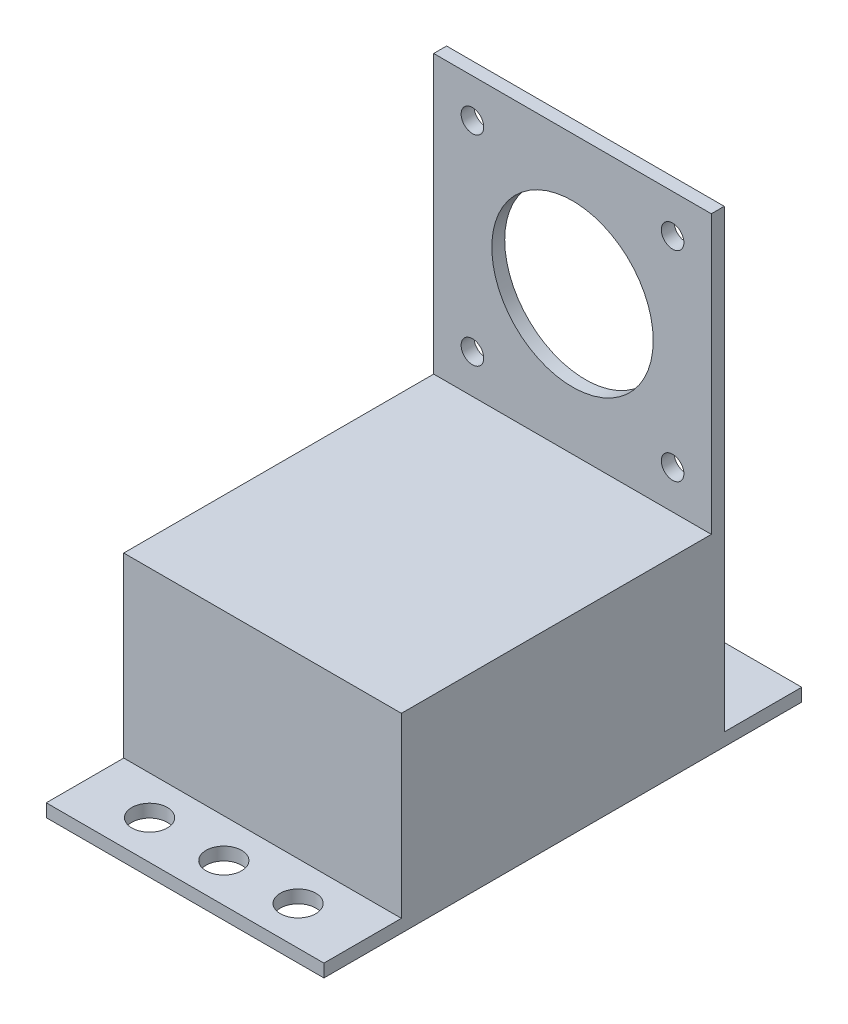
ISO-10303-21;
HEADER;
FILE_DESCRIPTION(('STEP AP214'),'2;1');
FILE_NAME('part.step','',(''),(''),'','','');
FILE_SCHEMA(('AUTOMOTIVE_DESIGN { 1 0 10303 214 1 1 1 1 }'));
ENDSEC;
DATA;
#1=APPLICATION_CONTEXT('core data for automotive mechanical design processes');
#2=APPLICATION_PROTOCOL_DEFINITION('international standard','automotive_design',2000,#1);
#3=PRODUCT_CONTEXT('',#1,'mechanical');
#4=PRODUCT('Part','Part','',(#3));
#5=PRODUCT_RELATED_PRODUCT_CATEGORY('part','',(#4));
#6=PRODUCT_DEFINITION_FORMATION('','',#4);
#7=PRODUCT_DEFINITION_CONTEXT('part definition',#1,'design');
#8=PRODUCT_DEFINITION('design','',#6,#7);
#9=PRODUCT_DEFINITION_SHAPE('','',#8);
#10=(LENGTH_UNIT() NAMED_UNIT(*) SI_UNIT(.MILLI.,.METRE.));
#11=(NAMED_UNIT(*) PLANE_ANGLE_UNIT() SI_UNIT($,.RADIAN.));
#12=(NAMED_UNIT(*) SI_UNIT($,.STERADIAN.) SOLID_ANGLE_UNIT());
#13=UNCERTAINTY_MEASURE_WITH_UNIT(LENGTH_MEASURE(1.E-05),#10,'distance_accuracy_value','');
#14=(GEOMETRIC_REPRESENTATION_CONTEXT(3) GLOBAL_UNCERTAINTY_ASSIGNED_CONTEXT((#13)) GLOBAL_UNIT_ASSIGNED_CONTEXT((#10,
#11,#12)) REPRESENTATION_CONTEXT('',''));
#15=CARTESIAN_POINT('',(0.,0.,0.));
#16=DIRECTION('',(0.,0.,1.));
#17=DIRECTION('',(1.,0.,0.));
#18=AXIS2_PLACEMENT_3D('',#15,#16,#17);
#19=CARTESIAN_POINT('',(-21.5,-29.5,37.));
#20=DIRECTION('',(0.,0.,1.));
#21=DIRECTION('',(1.,0.,0.));
#22=AXIS2_PLACEMENT_3D('',#19,#20,#21);
#23=PLANE('',#22);
#24=DIRECTION('',(0.,1.,0.));
#25=VECTOR('',#24,1.);
#26=CARTESIAN_POINT('',(21.5,-29.5,37.));
#27=LINE('',#26,#25);
#28=CARTESIAN_POINT('',(21.5,-29.5,37.));
#29=VERTEX_POINT('',#28);
#30=CARTESIAN_POINT('',(21.5,-27.5,37.));
#31=VERTEX_POINT('',#30);
#32=EDGE_CURVE('E203',#29,#31,#27,.T.);
#33=ORIENTED_EDGE('',*,*,#32,.T.);
#34=DIRECTION('',(1.,0.,0.));
#35=VECTOR('',#34,1.);
#36=CARTESIAN_POINT('',(21.5,-27.5,37.));
#37=LINE('',#36,#35);
#38=CARTESIAN_POINT('',(-21.5,-27.5,37.));
#39=VERTEX_POINT('',#38);
#40=EDGE_CURVE('E135',#39,#31,#37,.T.);
#41=ORIENTED_EDGE('',*,*,#40,.F.);
#42=DIRECTION('',(0.,1.,0.));
#43=VECTOR('',#42,1.);
#44=CARTESIAN_POINT('',(-21.5,-29.5,37.));
#45=LINE('',#44,#43);
#46=CARTESIAN_POINT('',(-21.5,-29.5,37.));
#47=VERTEX_POINT('',#46);
#48=EDGE_CURVE('E119',#47,#39,#45,.T.);
#49=ORIENTED_EDGE('',*,*,#48,.F.);
#50=DIRECTION('',(1.,0.,0.));
#51=VECTOR('',#50,1.);
#52=CARTESIAN_POINT('',(-21.5,-29.5,37.));
#53=LINE('',#52,#51);
#54=EDGE_CURVE('E191',#47,#29,#53,.T.);
#55=ORIENTED_EDGE('',*,*,#54,.T.);
#56=EDGE_LOOP('',(#33,#41,#49,#55));
#57=FACE_BOUND('',#56,.T.);
#58=ADVANCED_FACE('F35',(#57),#23,.T.);
#59=CARTESIAN_POINT('',(0.,-29.501,31.));
#60=DIRECTION('',(0.,1.,0.));
#61=DIRECTION('',(0.,0.,1.));
#62=AXIS2_PLACEMENT_3D('',#59,#60,#61);
#63=CYLINDRICAL_SURFACE('',#62,2.75);
#64=CARTESIAN_POINT('',(0.,-29.5,31.));
#65=DIRECTION('',(0.,1.,0.));
#66=DIRECTION('',(0.,0.,1.));
#67=AXIS2_PLACEMENT_3D('',#64,#65,#66);
#68=CIRCLE('',#67,2.75);
#69=CARTESIAN_POINT('',(0.,-29.5,33.75));
#70=VERTEX_POINT('',#69);
#71=EDGE_CURVE('E155',#70,#70,#68,.F.);
#72=ORIENTED_EDGE('',*,*,#71,.T.);
#73=EDGE_LOOP('',(#72));
#74=FACE_BOUND('',#73,.T.);
#75=CARTESIAN_POINT('',(0.,-27.5,31.));
#76=DIRECTION('',(0.,1.,0.));
#77=DIRECTION('',(0.,0.,1.));
#78=AXIS2_PLACEMENT_3D('',#75,#76,#77);
#79=CIRCLE('',#78,2.75);
#80=CARTESIAN_POINT('',(0.,-27.5,33.75));
#81=VERTEX_POINT('',#80);
#82=EDGE_CURVE('E128',#81,#81,#79,.F.);
#83=ORIENTED_EDGE('',*,*,#82,.F.);
#84=EDGE_LOOP('',(#83));
#85=FACE_BOUND('',#84,.T.);
#86=ADVANCED_FACE('F296',(#74,#85),#63,.F.);
#87=CARTESIAN_POINT('',(11.5,-29.501,31.));
#88=DIRECTION('',(0.,1.,0.));
#89=DIRECTION('',(0.,0.,1.));
#90=AXIS2_PLACEMENT_3D('',#87,#88,#89);
#91=CYLINDRICAL_SURFACE('',#90,2.75);
#92=CARTESIAN_POINT('',(11.5,-29.5,31.));
#93=DIRECTION('',(0.,1.,0.));
#94=DIRECTION('',(0.,0.,1.));
#95=AXIS2_PLACEMENT_3D('',#92,#93,#94);
#96=CIRCLE('',#95,2.75);
#97=CARTESIAN_POINT('',(11.5,-29.5,33.75));
#98=VERTEX_POINT('',#97);
#99=EDGE_CURVE('E143',#98,#98,#96,.F.);
#100=ORIENTED_EDGE('',*,*,#99,.T.);
#101=EDGE_LOOP('',(#100));
#102=FACE_BOUND('',#101,.T.);
#103=CARTESIAN_POINT('',(11.5,-27.5,31.));
#104=DIRECTION('',(0.,1.,0.));
#105=DIRECTION('',(0.,0.,1.));
#106=AXIS2_PLACEMENT_3D('',#103,#104,#105);
#107=CIRCLE('',#106,2.75);
#108=CARTESIAN_POINT('',(11.5,-27.5,33.75));
#109=VERTEX_POINT('',#108);
#110=EDGE_CURVE('E123',#109,#109,#107,.F.);
#111=ORIENTED_EDGE('',*,*,#110,.F.);
#112=EDGE_LOOP('',(#111));
#113=FACE_BOUND('',#112,.T.);
#114=ADVANCED_FACE('F300',(#102,#113),#91,.F.);
#115=CARTESIAN_POINT('',(-11.5,-29.501,31.));
#116=DIRECTION('',(0.,1.,0.));
#117=DIRECTION('',(0.,0.,1.));
#118=AXIS2_PLACEMENT_3D('',#115,#116,#117);
#119=CYLINDRICAL_SURFACE('',#118,2.75);
#120=CARTESIAN_POINT('',(-11.5,-29.5,31.));
#121=DIRECTION('',(0.,1.,0.));
#122=DIRECTION('',(0.,0.,1.));
#123=AXIS2_PLACEMENT_3D('',#120,#121,#122);
#124=CIRCLE('',#123,2.75);
#125=CARTESIAN_POINT('',(-11.5,-29.5,33.75));
#126=VERTEX_POINT('',#125);
#127=EDGE_CURVE('E144',#126,#126,#124,.F.);
#128=ORIENTED_EDGE('',*,*,#127,.T.);
#129=EDGE_LOOP('',(#128));
#130=FACE_BOUND('',#129,.T.);
#131=CARTESIAN_POINT('',(-11.5,-27.5,31.));
#132=DIRECTION('',(0.,1.,0.));
#133=DIRECTION('',(0.,0.,1.));
#134=AXIS2_PLACEMENT_3D('',#131,#132,#133);
#135=CIRCLE('',#134,2.75);
#136=CARTESIAN_POINT('',(-11.5,-27.5,33.75));
#137=VERTEX_POINT('',#136);
#138=EDGE_CURVE('E121',#137,#137,#135,.F.);
#139=ORIENTED_EDGE('',*,*,#138,.F.);
#140=EDGE_LOOP('',(#139));
#141=FACE_BOUND('',#140,.T.);
#142=ADVANCED_FACE('F315',(#130,#141),#119,.F.);
#143=CARTESIAN_POINT('',(-21.5,43.,0.));
#144=DIRECTION('',(-1.,0.,0.));
#145=DIRECTION('',(0.,0.,1.));
#146=AXIS2_PLACEMENT_3D('',#143,#144,#145);
#147=PLANE('',#146);
#148=DIRECTION('',(0.,-1.,0.));
#149=VECTOR('',#148,1.);
#150=CARTESIAN_POINT('',(-21.5,43.,-25.));
#151=LINE('',#150,#149);
#152=CARTESIAN_POINT('',(-21.5,43.,-25.));
#153=VERTEX_POINT('',#152);
#154=CARTESIAN_POINT('',(-21.5,-27.5,-25.));
#155=VERTEX_POINT('',#154);
#156=EDGE_CURVE('E61',#153,#155,#151,.T.);
#157=ORIENTED_EDGE('',*,*,#156,.T.);
#158=DIRECTION('',(0.,0.,1.));
#159=VECTOR('',#158,1.);
#160=CARTESIAN_POINT('',(-21.5,-27.5,-37.));
#161=LINE('',#160,#159);
#162=CARTESIAN_POINT('',(-21.5,-27.5,-37.));
#163=VERTEX_POINT('',#162);
#164=EDGE_CURVE('E232',#163,#155,#161,.T.);
#165=ORIENTED_EDGE('',*,*,#164,.F.);
#166=DIRECTION('',(0.,1.,0.));
#167=VECTOR('',#166,1.);
#168=CARTESIAN_POINT('',(-21.5,-29.5,-37.));
#169=LINE('',#168,#167);
#170=CARTESIAN_POINT('',(-21.5,-29.5,-37.));
#171=VERTEX_POINT('',#170);
#172=EDGE_CURVE('E208',#171,#163,#169,.T.);
#173=ORIENTED_EDGE('',*,*,#172,.F.);
#174=DIRECTION('',(0.,0.,-1.));
#175=VECTOR('',#174,1.);
#176=CARTESIAN_POINT('',(-21.5,-29.5,37.));
#177=LINE('',#176,#175);
#178=EDGE_CURVE('E200',#47,#171,#177,.T.);
#179=ORIENTED_EDGE('',*,*,#178,.F.);
#180=ORIENTED_EDGE('',*,*,#48,.T.);
#181=DIRECTION('',(0.,0.,1.));
#182=VECTOR('',#181,1.);
#183=CARTESIAN_POINT('',(-21.5,-27.5,37.));
#184=LINE('',#183,#182);
#185=CARTESIAN_POINT('',(-21.5,-27.5,25.));
#186=VERTEX_POINT('',#185);
#187=EDGE_CURVE('E52',#186,#39,#184,.T.);
#188=ORIENTED_EDGE('',*,*,#187,.F.);
#189=DIRECTION('',(0.,1.,0.));
#190=VECTOR('',#189,1.);
#191=CARTESIAN_POINT('',(-21.5,-27.5,25.));
#192=LINE('',#191,#190);
#193=CARTESIAN_POINT('',(-21.5,0.,25.));
#194=VERTEX_POINT('',#193);
#195=EDGE_CURVE('E124',#186,#194,#192,.T.);
#196=ORIENTED_EDGE('',*,*,#195,.T.);
#197=DIRECTION('',(0.,0.,-1.));
#198=VECTOR('',#197,1.);
#199=CARTESIAN_POINT('',(-21.5,0.,37.));
#200=LINE('',#199,#198);
#201=CARTESIAN_POINT('',(-21.5,0.,-23.));
#202=VERTEX_POINT('',#201);
#203=EDGE_CURVE('E85',#194,#202,#200,.T.);
#204=ORIENTED_EDGE('',*,*,#203,.T.);
#205=DIRECTION('',(0.,-1.,0.));
#206=VECTOR('',#205,1.);
#207=CARTESIAN_POINT('',(-21.5,43.,-23.));
#208=LINE('',#207,#206);
#209=CARTESIAN_POINT('',(-21.5,43.,-23.));
#210=VERTEX_POINT('',#209);
#211=EDGE_CURVE('E11',#210,#202,#208,.T.);
#212=ORIENTED_EDGE('',*,*,#211,.F.);
#213=DIRECTION('',(0.,0.,-1.));
#214=VECTOR('',#213,1.);
#215=CARTESIAN_POINT('',(-21.5,43.,0.));
#216=LINE('',#215,#214);
#217=EDGE_CURVE('E101',#210,#153,#216,.T.);
#218=ORIENTED_EDGE('',*,*,#217,.T.);
#219=EDGE_LOOP('',(#157,#165,#173,#179,#180,#188,#196,#204,#212,#218));
#220=FACE_BOUND('',#219,.T.);
#221=ADVANCED_FACE('F37',(#220),#147,.T.);
#222=CARTESIAN_POINT('',(0.,43.,-23.));
#223=DIRECTION('',(0.,0.,-1.));
#224=DIRECTION('',(-1.,0.,0.));
#225=AXIS2_PLACEMENT_3D('',#222,#223,#224);
#226=PLANE('',#225);
#227=CARTESIAN_POINT('',(15.5000000000001,37.0000000000004,-23.));
#228=DIRECTION('',(0.,0.,1.));
#229=DIRECTION('',(1.,0.,0.));
#230=AXIS2_PLACEMENT_3D('',#227,#228,#229);
#231=CIRCLE('',#230,1.75);
#232=CARTESIAN_POINT('',(17.2500000000001,37.0000000000004,-23.));
#233=VERTEX_POINT('',#232);
#234=EDGE_CURVE('E161',#233,#233,#231,.T.);
#235=ORIENTED_EDGE('',*,*,#234,.F.);
#236=EDGE_LOOP('',(#235));
#237=FACE_BOUND('',#236,.T.);
#238=CARTESIAN_POINT('',(-15.4999999999996,5.99999999999993,-23.));
#239=DIRECTION('',(0.,0.,1.));
#240=DIRECTION('',(1.,0.,0.));
#241=AXIS2_PLACEMENT_3D('',#238,#239,#240);
#242=CIRCLE('',#241,1.75);
#243=CARTESIAN_POINT('',(-13.7499999999996,5.99999999999993,-23.));
#244=VERTEX_POINT('',#243);
#245=EDGE_CURVE('E166',#244,#244,#242,.T.);
#246=ORIENTED_EDGE('',*,*,#245,.F.);
#247=EDGE_LOOP('',(#246));
#248=FACE_BOUND('',#247,.T.);
#249=CARTESIAN_POINT('',(15.5000000000004,6.00000000000031,-23.));
#250=DIRECTION('',(0.,0.,1.));
#251=DIRECTION('',(1.,0.,0.));
#252=AXIS2_PLACEMENT_3D('',#249,#250,#251);
#253=CIRCLE('',#252,1.75);
#254=CARTESIAN_POINT('',(17.2500000000004,6.00000000000031,-23.));
#255=VERTEX_POINT('',#254);
#256=EDGE_CURVE('E165',#255,#255,#253,.T.);
#257=ORIENTED_EDGE('',*,*,#256,.F.);
#258=EDGE_LOOP('',(#257));
#259=FACE_BOUND('',#258,.T.);
#260=CARTESIAN_POINT('',(-15.5,37.,-23.));
#261=DIRECTION('',(0.,0.,1.));
#262=DIRECTION('',(1.,0.,0.));
#263=AXIS2_PLACEMENT_3D('',#260,#261,#262);
#264=CIRCLE('',#263,1.75);
#265=CARTESIAN_POINT('',(-13.75,37.,-23.));
#266=VERTEX_POINT('',#265);
#267=EDGE_CURVE('E178',#266,#266,#264,.T.);
#268=ORIENTED_EDGE('',*,*,#267,.F.);
#269=EDGE_LOOP('',(#268));
#270=FACE_BOUND('',#269,.T.);
#271=CARTESIAN_POINT('',(0.,21.5,-23.));
#272=DIRECTION('',(0.,0.,1.));
#273=DIRECTION('',(1.,0.,0.));
#274=AXIS2_PLACEMENT_3D('',#271,#272,#273);
#275=CIRCLE('',#274,12.5);
#276=CARTESIAN_POINT('',(12.5,21.5,-23.));
#277=VERTEX_POINT('',#276);
#278=EDGE_CURVE('E186',#277,#277,#275,.T.);
#279=ORIENTED_EDGE('',*,*,#278,.F.);
#280=EDGE_LOOP('',(#279));
#281=FACE_BOUND('',#280,.T.);
#282=DIRECTION('',(1.,0.,0.));
#283=VECTOR('',#282,1.);
#284=CARTESIAN_POINT('',(0.,0.,-23.));
#285=LINE('',#284,#283);
#286=CARTESIAN_POINT('',(21.5,0.,-23.));
#287=VERTEX_POINT('',#286);
#288=EDGE_CURVE('E106',#202,#287,#285,.T.);
#289=ORIENTED_EDGE('',*,*,#288,.T.);
#290=DIRECTION('',(0.,-1.,0.));
#291=VECTOR('',#290,1.);
#292=CARTESIAN_POINT('',(21.5,43.,-23.));
#293=LINE('',#292,#291);
#294=CARTESIAN_POINT('',(21.5,43.,-23.));
#295=VERTEX_POINT('',#294);
#296=EDGE_CURVE('E44',#295,#287,#293,.T.);
#297=ORIENTED_EDGE('',*,*,#296,.F.);
#298=DIRECTION('',(1.,0.,0.));
#299=VECTOR('',#298,1.);
#300=CARTESIAN_POINT('',(0.,43.,-23.));
#301=LINE('',#300,#299);
#302=EDGE_CURVE('E94',#210,#295,#301,.T.);
#303=ORIENTED_EDGE('',*,*,#302,.F.);
#304=ORIENTED_EDGE('',*,*,#211,.T.);
#305=EDGE_LOOP('',(#289,#297,#303,#304));
#306=FACE_BOUND('',#305,.T.);
#307=ADVANCED_FACE('F105',(#237,#248,#259,#270,#281,#306),#226,.F.);
#308=CARTESIAN_POINT('',(21.5,43.,0.));
#309=DIRECTION('',(-1.,0.,0.));
#310=DIRECTION('',(0.,0.,1.));
#311=AXIS2_PLACEMENT_3D('',#308,#309,#310);
#312=PLANE('',#311);
#313=DIRECTION('',(0.,0.,-1.));
#314=VECTOR('',#313,1.);
#315=CARTESIAN_POINT('',(21.5,-27.5,-37.));
#316=LINE('',#315,#314);
#317=CARTESIAN_POINT('',(21.5,-27.5,-25.));
#318=VERTEX_POINT('',#317);
#319=CARTESIAN_POINT('',(21.5,-27.5,-37.));
#320=VERTEX_POINT('',#319);
#321=EDGE_CURVE('E230',#318,#320,#316,.T.);
#322=ORIENTED_EDGE('',*,*,#321,.F.);
#323=DIRECTION('',(0.,-1.,0.));
#324=VECTOR('',#323,1.);
#325=CARTESIAN_POINT('',(21.5,43.,-25.));
#326=LINE('',#325,#324);
#327=CARTESIAN_POINT('',(21.5,43.,-25.));
#328=VERTEX_POINT('',#327);
#329=EDGE_CURVE('E108',#328,#318,#326,.T.);
#330=ORIENTED_EDGE('',*,*,#329,.F.);
#331=DIRECTION('',(0.,0.,-1.));
#332=VECTOR('',#331,1.);
#333=CARTESIAN_POINT('',(21.5,43.,0.));
#334=LINE('',#333,#332);
#335=EDGE_CURVE('E99',#295,#328,#334,.T.);
#336=ORIENTED_EDGE('',*,*,#335,.F.);
#337=ORIENTED_EDGE('',*,*,#296,.T.);
#338=DIRECTION('',(0.,0.,-1.));
#339=VECTOR('',#338,1.);
#340=CARTESIAN_POINT('',(21.5,0.,37.));
#341=LINE('',#340,#339);
#342=CARTESIAN_POINT('',(21.5,0.,25.));
#343=VERTEX_POINT('',#342);
#344=EDGE_CURVE('E75',#343,#287,#341,.T.);
#345=ORIENTED_EDGE('',*,*,#344,.F.);
#346=DIRECTION('',(0.,1.,0.));
#347=VECTOR('',#346,1.);
#348=CARTESIAN_POINT('',(21.5,-27.5,25.));
#349=LINE('',#348,#347);
#350=CARTESIAN_POINT('',(21.5,-27.5,25.));
#351=VERTEX_POINT('',#350);
#352=EDGE_CURVE('E130',#351,#343,#349,.T.);
#353=ORIENTED_EDGE('',*,*,#352,.F.);
#354=DIRECTION('',(0.,0.,-1.));
#355=VECTOR('',#354,1.);
#356=CARTESIAN_POINT('',(21.5,-27.5,37.));
#357=LINE('',#356,#355);
#358=EDGE_CURVE('E246',#31,#351,#357,.T.);
#359=ORIENTED_EDGE('',*,*,#358,.F.);
#360=ORIENTED_EDGE('',*,*,#32,.F.);
#361=DIRECTION('',(0.,0.,-1.));
#362=VECTOR('',#361,1.);
#363=CARTESIAN_POINT('',(21.5,-29.5,37.));
#364=LINE('',#363,#362);
#365=CARTESIAN_POINT('',(21.5,-29.5,-37.));
#366=VERTEX_POINT('',#365);
#367=EDGE_CURVE('E194',#29,#366,#364,.T.);
#368=ORIENTED_EDGE('',*,*,#367,.T.);
#369=DIRECTION('',(0.,1.,0.));
#370=VECTOR('',#369,1.);
#371=CARTESIAN_POINT('',(21.5,-29.5,-37.));
#372=LINE('',#371,#370);
#373=EDGE_CURVE('E211',#366,#320,#372,.T.);
#374=ORIENTED_EDGE('',*,*,#373,.T.);
#375=EDGE_LOOP('',(#322,#330,#336,#337,#345,#353,#359,#360,#368,#374));
#376=FACE_BOUND('',#375,.T.);
#377=ADVANCED_FACE('F111',(#376),#312,.F.);
#378=CARTESIAN_POINT('',(0.,43.,-25.));
#379=DIRECTION('',(0.,0.,-1.));
#380=DIRECTION('',(-1.,0.,0.));
#381=AXIS2_PLACEMENT_3D('',#378,#379,#380);
#382=PLANE('',#381);
#383=CARTESIAN_POINT('',(15.5000000000001,37.0000000000004,-25.));
#384=DIRECTION('',(0.,0.,-1.));
#385=DIRECTION('',(-1.,0.,0.));
#386=AXIS2_PLACEMENT_3D('',#383,#384,#385);
#387=CIRCLE('',#386,1.75);
#388=CARTESIAN_POINT('',(13.7500000000001,37.0000000000004,-25.));
#389=VERTEX_POINT('',#388);
#390=EDGE_CURVE('E169',#389,#389,#387,.F.);
#391=ORIENTED_EDGE('',*,*,#390,.T.);
#392=EDGE_LOOP('',(#391));
#393=FACE_BOUND('',#392,.T.);
#394=CARTESIAN_POINT('',(-15.4999999999996,5.99999999999993,-25.));
#395=DIRECTION('',(0.,0.,-1.));
#396=DIRECTION('',(-1.,0.,0.));
#397=AXIS2_PLACEMENT_3D('',#394,#395,#396);
#398=CIRCLE('',#397,1.75);
#399=CARTESIAN_POINT('',(-17.2499999999996,5.99999999999993,-25.));
#400=VERTEX_POINT('',#399);
#401=EDGE_CURVE('E162',#400,#400,#398,.F.);
#402=ORIENTED_EDGE('',*,*,#401,.T.);
#403=EDGE_LOOP('',(#402));
#404=FACE_BOUND('',#403,.T.);
#405=CARTESIAN_POINT('',(15.5000000000004,6.00000000000031,-25.));
#406=DIRECTION('',(0.,0.,-1.));
#407=DIRECTION('',(-1.,0.,0.));
#408=AXIS2_PLACEMENT_3D('',#405,#406,#407);
#409=CIRCLE('',#408,1.75);
#410=CARTESIAN_POINT('',(13.7500000000004,6.00000000000031,-25.));
#411=VERTEX_POINT('',#410);
#412=EDGE_CURVE('E181',#411,#411,#409,.F.);
#413=ORIENTED_EDGE('',*,*,#412,.T.);
#414=EDGE_LOOP('',(#413));
#415=FACE_BOUND('',#414,.T.);
#416=CARTESIAN_POINT('',(-15.5,37.,-25.));
#417=DIRECTION('',(0.,0.,-1.));
#418=DIRECTION('',(-1.,0.,0.));
#419=AXIS2_PLACEMENT_3D('',#416,#417,#418);
#420=CIRCLE('',#419,1.75);
#421=CARTESIAN_POINT('',(-17.25,37.,-25.));
#422=VERTEX_POINT('',#421);
#423=EDGE_CURVE('E174',#422,#422,#420,.F.);
#424=ORIENTED_EDGE('',*,*,#423,.T.);
#425=EDGE_LOOP('',(#424));
#426=FACE_BOUND('',#425,.T.);
#427=CARTESIAN_POINT('',(0.,21.5,-25.));
#428=DIRECTION('',(0.,0.,-1.));
#429=DIRECTION('',(-1.,0.,0.));
#430=AXIS2_PLACEMENT_3D('',#427,#428,#429);
#431=CIRCLE('',#430,12.5);
#432=CARTESIAN_POINT('',(-12.5,21.5,-25.));
#433=VERTEX_POINT('',#432);
#434=EDGE_CURVE('E177',#433,#433,#431,.F.);
#435=ORIENTED_EDGE('',*,*,#434,.T.);
#436=EDGE_LOOP('',(#435));
#437=FACE_BOUND('',#436,.T.);
#438=ORIENTED_EDGE('',*,*,#329,.T.);
#439=DIRECTION('',(1.,0.,0.));
#440=VECTOR('',#439,1.);
#441=CARTESIAN_POINT('',(21.5,-27.5,-25.));
#442=LINE('',#441,#440);
#443=EDGE_CURVE('E221',#155,#318,#442,.T.);
#444=ORIENTED_EDGE('',*,*,#443,.F.);
#445=ORIENTED_EDGE('',*,*,#156,.F.);
#446=DIRECTION('',(1.,0.,0.));
#447=VECTOR('',#446,1.);
#448=CARTESIAN_POINT('',(0.,43.,-25.));
#449=LINE('',#448,#447);
#450=EDGE_CURVE('E113',#153,#328,#449,.T.);
#451=ORIENTED_EDGE('',*,*,#450,.T.);
#452=EDGE_LOOP('',(#438,#444,#445,#451));
#453=FACE_BOUND('',#452,.T.);
#454=ADVANCED_FACE('F218',(#393,#404,#415,#426,#437,#453),#382,.T.);
#455=CARTESIAN_POINT('',(0.,43.,0.));
#456=DIRECTION('',(0.,1.,0.));
#457=DIRECTION('',(0.,0.,1.));
#458=AXIS2_PLACEMENT_3D('',#455,#456,#457);
#459=PLANE('',#458);
#460=ORIENTED_EDGE('',*,*,#217,.F.);
#461=ORIENTED_EDGE('',*,*,#302,.T.);
#462=ORIENTED_EDGE('',*,*,#335,.T.);
#463=ORIENTED_EDGE('',*,*,#450,.F.);
#464=EDGE_LOOP('',(#460,#461,#462,#463));
#465=FACE_BOUND('',#464,.T.);
#466=ADVANCED_FACE('F96',(#465),#459,.T.);
#467=CARTESIAN_POINT('',(0.,0.,0.));
#468=DIRECTION('',(0.,1.,0.));
#469=DIRECTION('',(0.,0.,1.));
#470=AXIS2_PLACEMENT_3D('',#467,#468,#469);
#471=PLANE('',#470);
#472=DIRECTION('',(-1.,0.,0.));
#473=VECTOR('',#472,1.);
#474=CARTESIAN_POINT('',(21.5,0.,25.));
#475=LINE('',#474,#473);
#476=EDGE_CURVE('E138',#343,#194,#475,.T.);
#477=ORIENTED_EDGE('',*,*,#476,.F.);
#478=ORIENTED_EDGE('',*,*,#344,.T.);
#479=ORIENTED_EDGE('',*,*,#288,.F.);
#480=ORIENTED_EDGE('',*,*,#203,.F.);
#481=EDGE_LOOP('',(#477,#478,#479,#480));
#482=FACE_BOUND('',#481,.T.);
#483=ADVANCED_FACE('F284',(#482),#471,.T.);
#484=CARTESIAN_POINT('',(-21.5,-29.5,-37.));
#485=DIRECTION('',(0.,0.,1.));
#486=DIRECTION('',(1.,0.,0.));
#487=AXIS2_PLACEMENT_3D('',#484,#485,#486);
#488=PLANE('',#487);
#489=ORIENTED_EDGE('',*,*,#172,.T.);
#490=DIRECTION('',(-1.,0.,0.));
#491=VECTOR('',#490,1.);
#492=CARTESIAN_POINT('',(21.5,-27.5,-37.));
#493=LINE('',#492,#491);
#494=EDGE_CURVE('E235',#320,#163,#493,.T.);
#495=ORIENTED_EDGE('',*,*,#494,.F.);
#496=ORIENTED_EDGE('',*,*,#373,.F.);
#497=DIRECTION('',(1.,0.,0.));
#498=VECTOR('',#497,1.);
#499=CARTESIAN_POINT('',(-21.5,-29.5,-37.));
#500=LINE('',#499,#498);
#501=EDGE_CURVE('E197',#171,#366,#500,.T.);
#502=ORIENTED_EDGE('',*,*,#501,.F.);
#503=EDGE_LOOP('',(#489,#495,#496,#502));
#504=FACE_BOUND('',#503,.T.);
#505=ADVANCED_FACE('F282',(#504),#488,.F.);
#506=CARTESIAN_POINT('',(0.,-29.5,0.));
#507=DIRECTION('',(0.,1.,0.));
#508=DIRECTION('',(0.,0.,1.));
#509=AXIS2_PLACEMENT_3D('',#506,#507,#508);
#510=PLANE('',#509);
#511=ORIENTED_EDGE('',*,*,#127,.F.);
#512=EDGE_LOOP('',(#511));
#513=FACE_BOUND('',#512,.T.);
#514=CARTESIAN_POINT('',(11.5,-29.5,-31.));
#515=DIRECTION('',(0.,1.,0.));
#516=DIRECTION('',(0.,0.,1.));
#517=AXIS2_PLACEMENT_3D('',#514,#515,#516);
#518=CIRCLE('',#517,2.75);
#519=CARTESIAN_POINT('',(11.5,-29.5,-28.25));
#520=VERTEX_POINT('',#519);
#521=EDGE_CURVE('E148',#520,#520,#518,.F.);
#522=ORIENTED_EDGE('',*,*,#521,.F.);
#523=EDGE_LOOP('',(#522));
#524=FACE_BOUND('',#523,.T.);
#525=ORIENTED_EDGE('',*,*,#99,.F.);
#526=EDGE_LOOP('',(#525));
#527=FACE_BOUND('',#526,.T.);
#528=CARTESIAN_POINT('',(-11.5,-29.5,-31.));
#529=DIRECTION('',(0.,1.,0.));
#530=DIRECTION('',(0.,0.,1.));
#531=AXIS2_PLACEMENT_3D('',#528,#529,#530);
#532=CIRCLE('',#531,2.75);
#533=CARTESIAN_POINT('',(-11.5,-29.5,-28.25));
#534=VERTEX_POINT('',#533);
#535=EDGE_CURVE('E147',#534,#534,#532,.F.);
#536=ORIENTED_EDGE('',*,*,#535,.F.);
#537=EDGE_LOOP('',(#536));
#538=FACE_BOUND('',#537,.T.);
#539=ORIENTED_EDGE('',*,*,#71,.F.);
#540=EDGE_LOOP('',(#539));
#541=FACE_BOUND('',#540,.T.);
#542=CARTESIAN_POINT('',(0.,-29.5,-31.));
#543=DIRECTION('',(0.,1.,0.));
#544=DIRECTION('',(0.,0.,1.));
#545=AXIS2_PLACEMENT_3D('',#542,#543,#544);
#546=CIRCLE('',#545,2.75);
#547=CARTESIAN_POINT('',(0.,-29.5,-28.25));
#548=VERTEX_POINT('',#547);
#549=EDGE_CURVE('E158',#548,#548,#546,.F.);
#550=ORIENTED_EDGE('',*,*,#549,.F.);
#551=EDGE_LOOP('',(#550));
#552=FACE_BOUND('',#551,.T.);
#553=ORIENTED_EDGE('',*,*,#54,.F.);
#554=ORIENTED_EDGE('',*,*,#178,.T.);
#555=ORIENTED_EDGE('',*,*,#501,.T.);
#556=ORIENTED_EDGE('',*,*,#367,.F.);
#557=EDGE_LOOP('',(#553,#554,#555,#556));
#558=FACE_BOUND('',#557,.T.);
#559=ADVANCED_FACE('F267',(#513,#524,#527,#538,#541,#552,#558),#510,.F.);
#560=CARTESIAN_POINT('',(0.,21.5,-37.001));
#561=DIRECTION('',(0.,0.,1.));
#562=DIRECTION('',(1.,0.,0.));
#563=AXIS2_PLACEMENT_3D('',#560,#561,#562);
#564=CYLINDRICAL_SURFACE('',#563,12.5);
#565=ORIENTED_EDGE('',*,*,#434,.F.);
#566=EDGE_LOOP('',(#565));
#567=FACE_BOUND('',#566,.T.);
#568=ORIENTED_EDGE('',*,*,#278,.T.);
#569=EDGE_LOOP('',(#568));
#570=FACE_BOUND('',#569,.T.);
#571=ADVANCED_FACE('F290',(#567,#570),#564,.F.);
#572=CARTESIAN_POINT('',(-15.5,37.,-37.001));
#573=DIRECTION('',(0.,0.,1.));
#574=DIRECTION('',(1.,0.,0.));
#575=AXIS2_PLACEMENT_3D('',#572,#573,#574);
#576=CYLINDRICAL_SURFACE('',#575,1.75);
#577=ORIENTED_EDGE('',*,*,#423,.F.);
#578=EDGE_LOOP('',(#577));
#579=FACE_BOUND('',#578,.T.);
#580=ORIENTED_EDGE('',*,*,#267,.T.);
#581=EDGE_LOOP('',(#580));
#582=FACE_BOUND('',#581,.T.);
#583=ADVANCED_FACE('F327',(#579,#582),#576,.F.);
#584=CARTESIAN_POINT('',(15.5000000000004,6.00000000000031,-37.001));
#585=DIRECTION('',(0.,0.,1.));
#586=DIRECTION('',(1.,0.,0.));
#587=AXIS2_PLACEMENT_3D('',#584,#585,#586);
#588=CYLINDRICAL_SURFACE('',#587,1.75);
#589=ORIENTED_EDGE('',*,*,#412,.F.);
#590=EDGE_LOOP('',(#589));
#591=FACE_BOUND('',#590,.T.);
#592=ORIENTED_EDGE('',*,*,#256,.T.);
#593=EDGE_LOOP('',(#592));
#594=FACE_BOUND('',#593,.T.);
#595=ADVANCED_FACE('F333',(#591,#594),#588,.F.);
#596=CARTESIAN_POINT('',(-15.4999999999996,5.99999999999993,-37.001));
#597=DIRECTION('',(0.,0.,1.));
#598=DIRECTION('',(1.,0.,0.));
#599=AXIS2_PLACEMENT_3D('',#596,#597,#598);
#600=CYLINDRICAL_SURFACE('',#599,1.75);
#601=ORIENTED_EDGE('',*,*,#401,.F.);
#602=EDGE_LOOP('',(#601));
#603=FACE_BOUND('',#602,.T.);
#604=ORIENTED_EDGE('',*,*,#245,.T.);
#605=EDGE_LOOP('',(#604));
#606=FACE_BOUND('',#605,.T.);
#607=ADVANCED_FACE('F339',(#603,#606),#600,.F.);
#608=CARTESIAN_POINT('',(15.5000000000001,37.0000000000004,-37.001));
#609=DIRECTION('',(0.,0.,1.));
#610=DIRECTION('',(1.,0.,0.));
#611=AXIS2_PLACEMENT_3D('',#608,#609,#610);
#612=CYLINDRICAL_SURFACE('',#611,1.75);
#613=ORIENTED_EDGE('',*,*,#390,.F.);
#614=EDGE_LOOP('',(#613));
#615=FACE_BOUND('',#614,.T.);
#616=ORIENTED_EDGE('',*,*,#234,.T.);
#617=EDGE_LOOP('',(#616));
#618=FACE_BOUND('',#617,.T.);
#619=ADVANCED_FACE('F342',(#615,#618),#612,.F.);
#620=CARTESIAN_POINT('',(0.,-29.501,-31.));
#621=DIRECTION('',(0.,1.,0.));
#622=DIRECTION('',(0.,0.,1.));
#623=AXIS2_PLACEMENT_3D('',#620,#621,#622);
#624=CYLINDRICAL_SURFACE('',#623,2.75);
#625=CARTESIAN_POINT('',(0.,-27.5,-31.));
#626=DIRECTION('',(0.,-1.,0.));
#627=DIRECTION('',(0.,0.,-1.));
#628=AXIS2_PLACEMENT_3D('',#625,#626,#627);
#629=CIRCLE('',#628,2.75);
#630=CARTESIAN_POINT('',(0.,-27.5,-33.75));
#631=VERTEX_POINT('',#630);
#632=EDGE_CURVE('E243',#631,#631,#629,.F.);
#633=ORIENTED_EDGE('',*,*,#632,.T.);
#634=EDGE_LOOP('',(#633));
#635=FACE_BOUND('',#634,.T.);
#636=ORIENTED_EDGE('',*,*,#549,.T.);
#637=EDGE_LOOP('',(#636));
#638=FACE_BOUND('',#637,.T.);
#639=ADVANCED_FACE('F345',(#635,#638),#624,.F.);
#640=CARTESIAN_POINT('',(-11.5,-29.501,-31.));
#641=DIRECTION('',(0.,1.,0.));
#642=DIRECTION('',(0.,0.,1.));
#643=AXIS2_PLACEMENT_3D('',#640,#641,#642);
#644=CYLINDRICAL_SURFACE('',#643,2.75);
#645=CARTESIAN_POINT('',(-11.5,-27.5,-31.));
#646=DIRECTION('',(0.,-1.,0.));
#647=DIRECTION('',(0.,0.,-1.));
#648=AXIS2_PLACEMENT_3D('',#645,#646,#647);
#649=CIRCLE('',#648,2.75);
#650=CARTESIAN_POINT('',(-11.5,-27.5,-33.75));
#651=VERTEX_POINT('',#650);
#652=EDGE_CURVE('E240',#651,#651,#649,.F.);
#653=ORIENTED_EDGE('',*,*,#652,.T.);
#654=EDGE_LOOP('',(#653));
#655=FACE_BOUND('',#654,.T.);
#656=ORIENTED_EDGE('',*,*,#535,.T.);
#657=EDGE_LOOP('',(#656));
#658=FACE_BOUND('',#657,.T.);
#659=ADVANCED_FACE('F351',(#655,#658),#644,.F.);
#660=CARTESIAN_POINT('',(11.5,-29.501,-31.));
#661=DIRECTION('',(0.,1.,0.));
#662=DIRECTION('',(0.,0.,1.));
#663=AXIS2_PLACEMENT_3D('',#660,#661,#662);
#664=CYLINDRICAL_SURFACE('',#663,2.75);
#665=CARTESIAN_POINT('',(11.5,-27.5,-31.));
#666=DIRECTION('',(0.,-1.,0.));
#667=DIRECTION('',(0.,0.,-1.));
#668=AXIS2_PLACEMENT_3D('',#665,#666,#667);
#669=CIRCLE('',#668,2.75);
#670=CARTESIAN_POINT('',(11.5,-27.5,-33.75));
#671=VERTEX_POINT('',#670);
#672=EDGE_CURVE('E39',#671,#671,#669,.F.);
#673=ORIENTED_EDGE('',*,*,#672,.T.);
#674=EDGE_LOOP('',(#673));
#675=FACE_BOUND('',#674,.T.);
#676=ORIENTED_EDGE('',*,*,#521,.T.);
#677=EDGE_LOOP('',(#676));
#678=FACE_BOUND('',#677,.T.);
#679=ADVANCED_FACE('F356',(#675,#678),#664,.F.);
#680=CARTESIAN_POINT('',(0.,-27.5,0.));
#681=DIRECTION('',(0.,1.,0.));
#682=DIRECTION('',(0.,0.,1.));
#683=AXIS2_PLACEMENT_3D('',#680,#681,#682);
#684=PLANE('',#683);
#685=ORIENTED_EDGE('',*,*,#358,.T.);
#686=DIRECTION('',(-1.,0.,0.));
#687=VECTOR('',#686,1.);
#688=CARTESIAN_POINT('',(21.5,-27.5,25.));
#689=LINE('',#688,#687);
#690=EDGE_CURVE('E249',#351,#186,#689,.T.);
#691=ORIENTED_EDGE('',*,*,#690,.T.);
#692=ORIENTED_EDGE('',*,*,#187,.T.);
#693=ORIENTED_EDGE('',*,*,#40,.T.);
#694=EDGE_LOOP('',(#685,#691,#692,#693));
#695=FACE_BOUND('',#694,.T.);
#696=ORIENTED_EDGE('',*,*,#138,.T.);
#697=EDGE_LOOP('',(#696));
#698=FACE_BOUND('',#697,.T.);
#699=ORIENTED_EDGE('',*,*,#110,.T.);
#700=EDGE_LOOP('',(#699));
#701=FACE_BOUND('',#700,.T.);
#702=ORIENTED_EDGE('',*,*,#82,.T.);
#703=EDGE_LOOP('',(#702));
#704=FACE_BOUND('',#703,.T.);
#705=ADVANCED_FACE('F253',(#695,#698,#701,#704),#684,.T.);
#706=CARTESIAN_POINT('',(21.5,-27.5,25.));
#707=DIRECTION('',(0.,0.,-1.));
#708=DIRECTION('',(-1.,0.,0.));
#709=AXIS2_PLACEMENT_3D('',#706,#707,#708);
#710=PLANE('',#709);
#711=ORIENTED_EDGE('',*,*,#476,.T.);
#712=ORIENTED_EDGE('',*,*,#195,.F.);
#713=ORIENTED_EDGE('',*,*,#690,.F.);
#714=ORIENTED_EDGE('',*,*,#352,.T.);
#715=EDGE_LOOP('',(#711,#712,#713,#714));
#716=FACE_BOUND('',#715,.T.);
#717=ADVANCED_FACE('F367',(#716),#710,.F.);
#718=CARTESIAN_POINT('',(0.,-27.5,0.));
#719=DIRECTION('',(0.,-1.,0.));
#720=DIRECTION('',(0.,0.,-1.));
#721=AXIS2_PLACEMENT_3D('',#718,#719,#720);
#722=PLANE('',#721);
#723=ORIENTED_EDGE('',*,*,#652,.F.);
#724=EDGE_LOOP('',(#723));
#725=FACE_BOUND('',#724,.T.);
#726=ORIENTED_EDGE('',*,*,#321,.T.);
#727=ORIENTED_EDGE('',*,*,#494,.T.);
#728=ORIENTED_EDGE('',*,*,#164,.T.);
#729=ORIENTED_EDGE('',*,*,#443,.T.);
#730=EDGE_LOOP('',(#726,#727,#728,#729));
#731=FACE_BOUND('',#730,.T.);
#732=ORIENTED_EDGE('',*,*,#672,.F.);
#733=EDGE_LOOP('',(#732));
#734=FACE_BOUND('',#733,.T.);
#735=ORIENTED_EDGE('',*,*,#632,.F.);
#736=EDGE_LOOP('',(#735));
#737=FACE_BOUND('',#736,.T.);
#738=ADVANCED_FACE('F226',(#725,#731,#734,#737),#722,.F.);
#739=CLOSED_SHELL('',(#58,#86,#114,#142,#221,#307,#377,#454,#466,#483,#505,#559,#571,#583,#595,
#607,#619,#639,#659,#679,#705,#717,#738));
#740=MANIFOLD_SOLID_BREP('B2',#739);
#741=ADVANCED_BREP_SHAPE_REPRESENTATION('',(#18,#740),#14);
#742=SHAPE_DEFINITION_REPRESENTATION(#9,#741);
ENDSEC;
END-ISO-10303-21;
